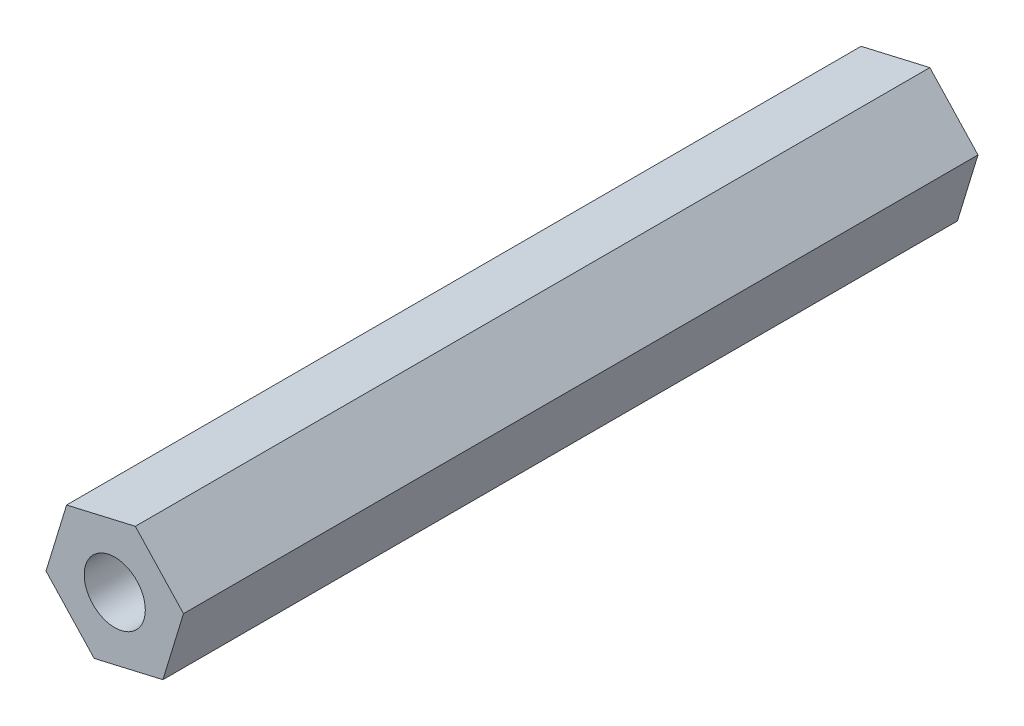
ISO-10303-21;
HEADER;
FILE_DESCRIPTION(('STEP AP214'),'2;1');
FILE_NAME('part.step','',(''),(''),'','','');
FILE_SCHEMA(('AUTOMOTIVE_DESIGN { 1 0 10303 214 1 1 1 1 }'));
ENDSEC;
DATA;
#1=APPLICATION_CONTEXT('core data for automotive mechanical design processes');
#2=APPLICATION_PROTOCOL_DEFINITION('international standard','automotive_design',2000,#1);
#3=PRODUCT_CONTEXT('',#1,'mechanical');
#4=PRODUCT('Part','Part','',(#3));
#5=PRODUCT_RELATED_PRODUCT_CATEGORY('part','',(#4));
#6=PRODUCT_DEFINITION_FORMATION('','',#4);
#7=PRODUCT_DEFINITION_CONTEXT('part definition',#1,'design');
#8=PRODUCT_DEFINITION('design','',#6,#7);
#9=PRODUCT_DEFINITION_SHAPE('','',#8);
#10=(LENGTH_UNIT() NAMED_UNIT(*) SI_UNIT(.MILLI.,.METRE.));
#11=(NAMED_UNIT(*) PLANE_ANGLE_UNIT() SI_UNIT($,.RADIAN.));
#12=(NAMED_UNIT(*) SI_UNIT($,.STERADIAN.) SOLID_ANGLE_UNIT());
#13=UNCERTAINTY_MEASURE_WITH_UNIT(LENGTH_MEASURE(1.E-05),#10,'distance_accuracy_value','');
#14=(GEOMETRIC_REPRESENTATION_CONTEXT(3) GLOBAL_UNCERTAINTY_ASSIGNED_CONTEXT((#13)) GLOBAL_UNIT_ASSIGNED_CONTEXT((#10,
#11,#12)) REPRESENTATION_CONTEXT('',''));
#15=CARTESIAN_POINT('',(0.,0.,0.));
#16=DIRECTION('',(0.,0.,1.));
#17=DIRECTION('',(1.,0.,0.));
#18=AXIS2_PLACEMENT_3D('',#15,#16,#17);
#19=CARTESIAN_POINT('',(-2.13898074345264,-7.01342246784494,82.55));
#20=DIRECTION('',(-0.225616607043094,0.974216170378198,0.));
#21=DIRECTION('',(-0.974216170378198,-0.225616607043094,0.));
#22=AXIS2_PLACEMENT_3D('',#19,#20,#21);
#23=PLANE('',#22);
#24=DIRECTION('',(0.974216170378198,0.225616607043094,0.));
#25=VECTOR('',#24,1.);
#26=CARTESIAN_POINT('',(-2.13898074345264,-7.01342246784494,0.));
#27=LINE('',#26,#25);
#28=CARTESIAN_POINT('',(-2.13898074345264,-7.01342246784494,0.));
#29=VERTEX_POINT('',#28);
#30=CARTESIAN_POINT('',(5.00431165289994,-5.35912289595818,0.));
#31=VERTEX_POINT('',#30);
#32=EDGE_CURVE('E122',#29,#31,#27,.T.);
#33=ORIENTED_EDGE('',*,*,#32,.T.);
#34=DIRECTION('',(0.,0.,-1.));
#35=VECTOR('',#34,1.);
#36=CARTESIAN_POINT('',(5.00431165289994,-5.35912289595818,82.55));
#37=LINE('',#36,#35);
#38=CARTESIAN_POINT('',(5.00431165289994,-5.35912289595818,82.55));
#39=VERTEX_POINT('',#38);
#40=EDGE_CURVE('E11',#39,#31,#37,.T.);
#41=ORIENTED_EDGE('',*,*,#40,.F.);
#42=DIRECTION('',(0.974216170378198,0.225616607043094,0.));
#43=VECTOR('',#42,1.);
#44=CARTESIAN_POINT('',(-2.13898074345264,-7.01342246784494,82.55));
#45=LINE('',#44,#43);
#46=CARTESIAN_POINT('',(-2.13898074345264,-7.01342246784494,82.55));
#47=VERTEX_POINT('',#46);
#48=EDGE_CURVE('E132',#47,#39,#45,.T.);
#49=ORIENTED_EDGE('',*,*,#48,.F.);
#50=DIRECTION('',(0.,0.,-1.));
#51=VECTOR('',#50,1.);
#52=CARTESIAN_POINT('',(-2.13898074345264,-7.01342246784494,82.55));
#53=LINE('',#52,#51);
#54=EDGE_CURVE('E118',#47,#29,#53,.T.);
#55=ORIENTED_EDGE('',*,*,#54,.T.);
#56=EDGE_LOOP('',(#33,#41,#49,#55));
#57=FACE_BOUND('',#56,.T.);
#58=ADVANCED_FACE('F37',(#57),#23,.F.);
#59=CARTESIAN_POINT('',(5.00431165289994,-5.35912289595818,82.55));
#60=DIRECTION('',(-0.956504255846656,0.291718371974128,0.));
#61=DIRECTION('',(-0.291718371974128,-0.956504255846656,0.));
#62=AXIS2_PLACEMENT_3D('',#59,#60,#61);
#63=PLANE('',#62);
#64=DIRECTION('',(0.291718371974128,0.956504255846656,0.));
#65=VECTOR('',#64,1.);
#66=CARTESIAN_POINT('',(5.00431165289994,-5.35912289595818,0.));
#67=LINE('',#66,#65);
#68=CARTESIAN_POINT('',(7.14329239635258,1.65429957188675,0.));
#69=VERTEX_POINT('',#68);
#70=EDGE_CURVE('E125',#31,#69,#67,.T.);
#71=ORIENTED_EDGE('',*,*,#70,.T.);
#72=DIRECTION('',(0.,0.,-1.));
#73=VECTOR('',#72,1.);
#74=CARTESIAN_POINT('',(7.14329239635258,1.65429957188675,82.55));
#75=LINE('',#74,#73);
#76=CARTESIAN_POINT('',(7.14329239635258,1.65429957188675,82.55));
#77=VERTEX_POINT('',#76);
#78=EDGE_CURVE('E46',#77,#69,#75,.T.);
#79=ORIENTED_EDGE('',*,*,#78,.F.);
#80=DIRECTION('',(0.291718371974128,0.956504255846656,0.));
#81=VECTOR('',#80,1.);
#82=CARTESIAN_POINT('',(5.00431165289994,-5.35912289595818,82.55));
#83=LINE('',#82,#81);
#84=EDGE_CURVE('E91',#39,#77,#83,.T.);
#85=ORIENTED_EDGE('',*,*,#84,.F.);
#86=ORIENTED_EDGE('',*,*,#40,.T.);
#87=EDGE_LOOP('',(#71,#79,#85,#86));
#88=FACE_BOUND('',#87,.T.);
#89=ADVANCED_FACE('F158',(#88),#63,.F.);
#90=CARTESIAN_POINT('',(7.14329239635258,1.65429957188675,82.55));
#91=DIRECTION('',(-0.730887648803561,-0.68249779840407,0.));
#92=DIRECTION('',(0.68249779840407,-0.730887648803561,0.));
#93=AXIS2_PLACEMENT_3D('',#90,#91,#92);
#94=PLANE('',#93);
#95=DIRECTION('',(-0.68249779840407,0.730887648803561,0.));
#96=VECTOR('',#95,1.);
#97=CARTESIAN_POINT('',(7.14329239635258,1.65429957188675,0.));
#98=LINE('',#97,#96);
#99=CARTESIAN_POINT('',(2.13898074345264,7.01342246784493,0.));
#100=VERTEX_POINT('',#99);
#101=EDGE_CURVE('E127',#69,#100,#98,.T.);
#102=ORIENTED_EDGE('',*,*,#101,.T.);
#103=DIRECTION('',(0.,0.,-1.));
#104=VECTOR('',#103,1.);
#105=CARTESIAN_POINT('',(2.13898074345264,7.01342246784493,82.55));
#106=LINE('',#105,#104);
#107=CARTESIAN_POINT('',(2.13898074345264,7.01342246784493,82.55));
#108=VERTEX_POINT('',#107);
#109=EDGE_CURVE('E113',#108,#100,#106,.T.);
#110=ORIENTED_EDGE('',*,*,#109,.F.);
#111=DIRECTION('',(-0.68249779840407,0.730887648803561,0.));
#112=VECTOR('',#111,1.);
#113=CARTESIAN_POINT('',(7.14329239635258,1.65429957188675,82.55));
#114=LINE('',#113,#112);
#115=EDGE_CURVE('E104',#77,#108,#114,.T.);
#116=ORIENTED_EDGE('',*,*,#115,.F.);
#117=ORIENTED_EDGE('',*,*,#78,.T.);
#118=EDGE_LOOP('',(#102,#110,#116,#117));
#119=FACE_BOUND('',#118,.T.);
#120=ADVANCED_FACE('F139',(#119),#94,.F.);
#121=CARTESIAN_POINT('',(2.13898074345264,7.01342246784493,82.55));
#122=DIRECTION('',(0.225616607043094,-0.974216170378198,0.));
#123=DIRECTION('',(0.974216170378198,0.225616607043094,0.));
#124=AXIS2_PLACEMENT_3D('',#121,#122,#123);
#125=PLANE('',#124);
#126=DIRECTION('',(-0.974216170378198,-0.225616607043094,0.));
#127=VECTOR('',#126,1.);
#128=CARTESIAN_POINT('',(2.13898074345264,7.01342246784493,0.));
#129=LINE('',#128,#127);
#130=CARTESIAN_POINT('',(-5.00431165289994,5.35912289595818,0.));
#131=VERTEX_POINT('',#130);
#132=EDGE_CURVE('E112',#100,#131,#129,.T.);
#133=ORIENTED_EDGE('',*,*,#132,.T.);
#134=DIRECTION('',(0.,0.,-1.));
#135=VECTOR('',#134,1.);
#136=CARTESIAN_POINT('',(-5.00431165289994,5.35912289595818,82.55));
#137=LINE('',#136,#135);
#138=CARTESIAN_POINT('',(-5.00431165289994,5.35912289595818,82.55));
#139=VERTEX_POINT('',#138);
#140=EDGE_CURVE('E109',#139,#131,#137,.T.);
#141=ORIENTED_EDGE('',*,*,#140,.F.);
#142=DIRECTION('',(-0.974216170378198,-0.225616607043094,0.));
#143=VECTOR('',#142,1.);
#144=CARTESIAN_POINT('',(2.13898074345264,7.01342246784493,82.55));
#145=LINE('',#144,#143);
#146=EDGE_CURVE('E98',#108,#139,#145,.T.);
#147=ORIENTED_EDGE('',*,*,#146,.F.);
#148=ORIENTED_EDGE('',*,*,#109,.T.);
#149=EDGE_LOOP('',(#133,#141,#147,#148));
#150=FACE_BOUND('',#149,.T.);
#151=ADVANCED_FACE('F110',(#150),#125,.F.);
#152=CARTESIAN_POINT('',(-5.00431165289994,5.35912289595818,82.55));
#153=DIRECTION('',(0.956504255846656,-0.291718371974128,0.));
#154=DIRECTION('',(0.291718371974128,0.956504255846656,0.));
#155=AXIS2_PLACEMENT_3D('',#152,#153,#154);
#156=PLANE('',#155);
#157=DIRECTION('',(-0.291718371974128,-0.956504255846656,0.));
#158=VECTOR('',#157,1.);
#159=CARTESIAN_POINT('',(-5.00431165289994,5.35912289595818,0.));
#160=LINE('',#159,#158);
#161=CARTESIAN_POINT('',(-7.14329239635258,-1.65429957188675,0.));
#162=VERTEX_POINT('',#161);
#163=EDGE_CURVE('E77',#131,#162,#160,.T.);
#164=ORIENTED_EDGE('',*,*,#163,.T.);
#165=DIRECTION('',(0.,0.,-1.));
#166=VECTOR('',#165,1.);
#167=CARTESIAN_POINT('',(-7.14329239635258,-1.65429957188675,82.55));
#168=LINE('',#167,#166);
#169=CARTESIAN_POINT('',(-7.14329239635258,-1.65429957188675,82.55));
#170=VERTEX_POINT('',#169);
#171=EDGE_CURVE('E114',#170,#162,#168,.T.);
#172=ORIENTED_EDGE('',*,*,#171,.F.);
#173=DIRECTION('',(-0.291718371974128,-0.956504255846656,0.));
#174=VECTOR('',#173,1.);
#175=CARTESIAN_POINT('',(-5.00431165289994,5.35912289595818,82.55));
#176=LINE('',#175,#174);
#177=EDGE_CURVE('E102',#139,#170,#176,.T.);
#178=ORIENTED_EDGE('',*,*,#177,.F.);
#179=ORIENTED_EDGE('',*,*,#140,.T.);
#180=EDGE_LOOP('',(#164,#172,#178,#179));
#181=FACE_BOUND('',#180,.T.);
#182=ADVANCED_FACE('F116',(#181),#156,.F.);
#183=CARTESIAN_POINT('',(-7.14329239635258,-1.65429957188675,82.55));
#184=DIRECTION('',(0.730887648803561,0.682497798404069,0.));
#185=DIRECTION('',(-0.68249779840407,0.730887648803561,0.));
#186=AXIS2_PLACEMENT_3D('',#183,#184,#185);
#187=PLANE('',#186);
#188=DIRECTION('',(0.68249779840407,-0.730887648803561,0.));
#189=VECTOR('',#188,1.);
#190=CARTESIAN_POINT('',(-7.14329239635258,-1.65429957188675,0.));
#191=LINE('',#190,#189);
#192=EDGE_CURVE('E83',#162,#29,#191,.T.);
#193=ORIENTED_EDGE('',*,*,#192,.T.);
#194=ORIENTED_EDGE('',*,*,#54,.F.);
#195=DIRECTION('',(0.68249779840407,-0.730887648803561,0.));
#196=VECTOR('',#195,1.);
#197=CARTESIAN_POINT('',(-7.14329239635258,-1.65429957188675,82.55));
#198=LINE('',#197,#196);
#199=EDGE_CURVE('E54',#170,#47,#198,.T.);
#200=ORIENTED_EDGE('',*,*,#199,.F.);
#201=ORIENTED_EDGE('',*,*,#171,.T.);
#202=EDGE_LOOP('',(#193,#194,#200,#201));
#203=FACE_BOUND('',#202,.T.);
#204=ADVANCED_FACE('F146',(#203),#187,.F.);
#205=CARTESIAN_POINT('',(0.,0.,82.55));
#206=DIRECTION('',(0.,0.,1.));
#207=DIRECTION('',(1.,0.,0.));
#208=AXIS2_PLACEMENT_3D('',#205,#206,#207);
#209=PLANE('',#208);
#210=CARTESIAN_POINT('',(0.,0.,82.55));
#211=DIRECTION('',(0.,0.,1.));
#212=DIRECTION('',(1.,0.,0.));
#213=AXIS2_PLACEMENT_3D('',#210,#211,#212);
#214=CIRCLE('',#213,3.175);
#215=CARTESIAN_POINT('',(3.175,0.,82.55));
#216=VERTEX_POINT('',#215);
#217=EDGE_CURVE('E243',#216,#216,#214,.T.);
#218=ORIENTED_EDGE('',*,*,#217,.F.);
#219=EDGE_LOOP('',(#218));
#220=FACE_BOUND('',#219,.T.);
#221=ORIENTED_EDGE('',*,*,#48,.T.);
#222=ORIENTED_EDGE('',*,*,#84,.T.);
#223=ORIENTED_EDGE('',*,*,#115,.T.);
#224=ORIENTED_EDGE('',*,*,#146,.T.);
#225=ORIENTED_EDGE('',*,*,#177,.T.);
#226=ORIENTED_EDGE('',*,*,#199,.T.);
#227=EDGE_LOOP('',(#221,#222,#223,#224,#225,#226));
#228=FACE_BOUND('',#227,.T.);
#229=ADVANCED_FACE('F100',(#220,#228),#209,.T.);
#230=CARTESIAN_POINT('',(0.,0.,0.));
#231=DIRECTION('',(0.,0.,1.));
#232=DIRECTION('',(1.,0.,0.));
#233=AXIS2_PLACEMENT_3D('',#230,#231,#232);
#234=PLANE('',#233);
#235=CARTESIAN_POINT('',(0.,0.,0.));
#236=DIRECTION('',(0.,0.,1.));
#237=DIRECTION('',(1.,0.,0.));
#238=AXIS2_PLACEMENT_3D('',#235,#236,#237);
#239=CIRCLE('',#238,3.175);
#240=CARTESIAN_POINT('',(3.175,0.,0.));
#241=VERTEX_POINT('',#240);
#242=EDGE_CURVE('E40',#241,#241,#239,.T.);
#243=ORIENTED_EDGE('',*,*,#242,.T.);
#244=EDGE_LOOP('',(#243));
#245=FACE_BOUND('',#244,.T.);
#246=ORIENTED_EDGE('',*,*,#32,.F.);
#247=ORIENTED_EDGE('',*,*,#192,.F.);
#248=ORIENTED_EDGE('',*,*,#163,.F.);
#249=ORIENTED_EDGE('',*,*,#132,.F.);
#250=ORIENTED_EDGE('',*,*,#101,.F.);
#251=ORIENTED_EDGE('',*,*,#70,.F.);
#252=EDGE_LOOP('',(#246,#247,#248,#249,#250,#251));
#253=FACE_BOUND('',#252,.T.);
#254=ADVANCED_FACE('F142',(#245,#253),#234,.F.);
#255=CARTESIAN_POINT('',(0.,0.,-44.45));
#256=DIRECTION('',(0.,0.,1.));
#257=DIRECTION('',(1.,0.,0.));
#258=AXIS2_PLACEMENT_3D('',#255,#256,#257);
#259=CYLINDRICAL_SURFACE('',#258,3.175);
#260=ORIENTED_EDGE('',*,*,#217,.T.);
#261=EDGE_LOOP('',(#260));
#262=FACE_BOUND('',#261,.T.);
#263=ORIENTED_EDGE('',*,*,#242,.F.);
#264=EDGE_LOOP('',(#263));
#265=FACE_BOUND('',#264,.T.);
#266=ADVANCED_FACE('F198',(#262,#265),#259,.F.);
#267=CLOSED_SHELL('',(#58,#89,#120,#151,#182,#204,#229,#254,#266));
#268=MANIFOLD_SOLID_BREP('B2',#267);
#269=ADVANCED_BREP_SHAPE_REPRESENTATION('',(#18,#268),#14);
#270=SHAPE_DEFINITION_REPRESENTATION(#9,#269);
ENDSEC;
END-ISO-10303-21;
